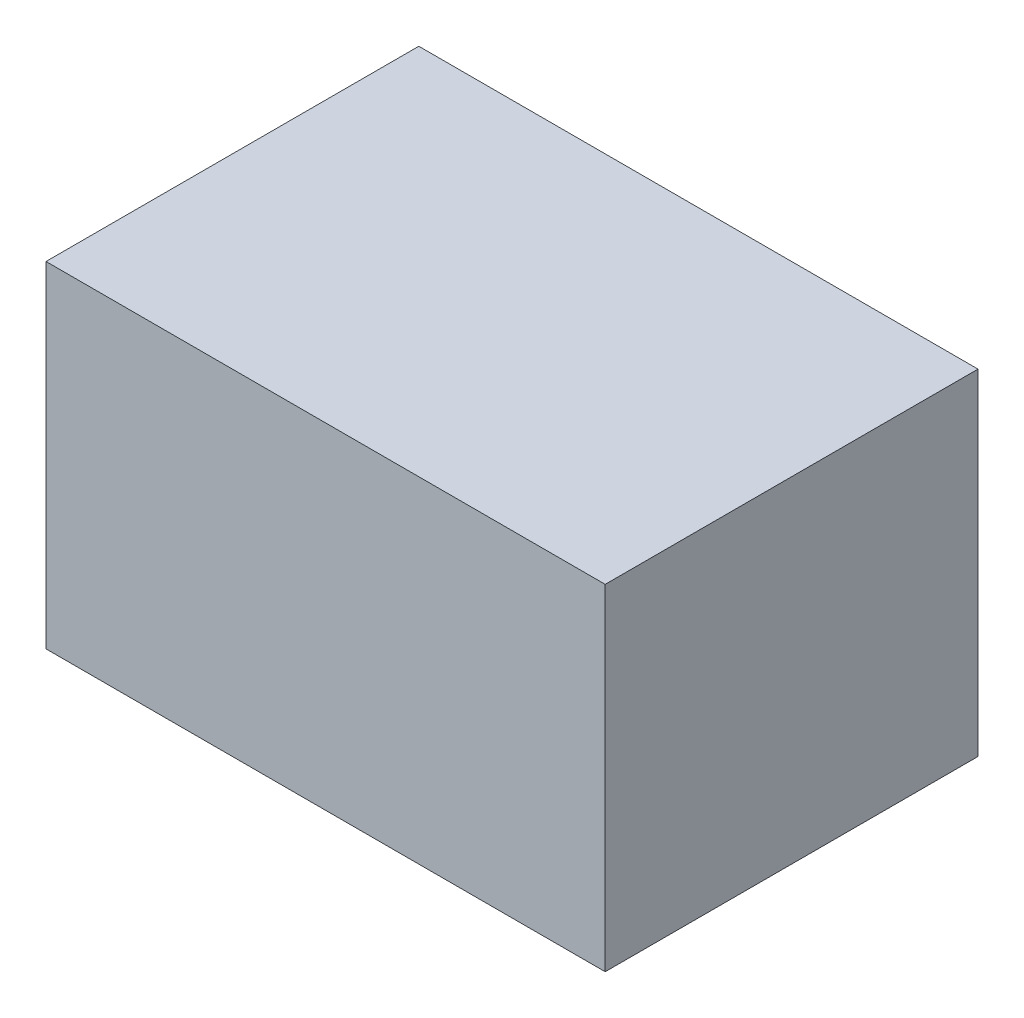
ISO-10303-21;
HEADER;
FILE_DESCRIPTION(('STEP AP214'),'2;1');
FILE_NAME('part.step','',(''),(''),'','','');
FILE_SCHEMA(('AUTOMOTIVE_DESIGN { 1 0 10303 214 1 1 1 1 }'));
ENDSEC;
DATA;
#1=APPLICATION_CONTEXT('core data for automotive mechanical design processes');
#2=APPLICATION_PROTOCOL_DEFINITION('international standard','automotive_design',2000,#1);
#3=PRODUCT_CONTEXT('',#1,'mechanical');
#4=PRODUCT('Part','Part','',(#3));
#5=PRODUCT_RELATED_PRODUCT_CATEGORY('part','',(#4));
#6=PRODUCT_DEFINITION_FORMATION('','',#4);
#7=PRODUCT_DEFINITION_CONTEXT('part definition',#1,'design');
#8=PRODUCT_DEFINITION('design','',#6,#7);
#9=PRODUCT_DEFINITION_SHAPE('','',#8);
#10=(LENGTH_UNIT() NAMED_UNIT(*) SI_UNIT(.MILLI.,.METRE.));
#11=(NAMED_UNIT(*) PLANE_ANGLE_UNIT() SI_UNIT($,.RADIAN.));
#12=(NAMED_UNIT(*) SI_UNIT($,.STERADIAN.) SOLID_ANGLE_UNIT());
#13=UNCERTAINTY_MEASURE_WITH_UNIT(LENGTH_MEASURE(1.E-05),#10,'distance_accuracy_value','');
#14=(GEOMETRIC_REPRESENTATION_CONTEXT(3) GLOBAL_UNCERTAINTY_ASSIGNED_CONTEXT((#13)) GLOBAL_UNIT_ASSIGNED_CONTEXT((#10,
#11,#12)) REPRESENTATION_CONTEXT('',''));
#15=CARTESIAN_POINT('',(0.,0.,0.));
#16=DIRECTION('',(0.,0.,1.));
#17=DIRECTION('',(1.,0.,0.));
#18=AXIS2_PLACEMENT_3D('',#15,#16,#17);
#19=CARTESIAN_POINT('',(0.,18.,0.));
#20=DIRECTION('',(1.,0.,0.));
#21=DIRECTION('',(0.,0.,-1.));
#22=AXIS2_PLACEMENT_3D('',#19,#20,#21);
#23=PLANE('',#22);
#24=DIRECTION('',(0.,0.,1.));
#25=VECTOR('',#24,1.);
#26=CARTESIAN_POINT('',(0.,0.,0.));
#27=LINE('',#26,#25);
#28=CARTESIAN_POINT('',(0.,0.,-20.));
#29=VERTEX_POINT('',#28);
#30=CARTESIAN_POINT('',(0.,0.,0.));
#31=VERTEX_POINT('',#30);
#32=EDGE_CURVE('E96',#29,#31,#27,.T.);
#33=ORIENTED_EDGE('',*,*,#32,.T.);
#34=DIRECTION('',(0.,-1.,0.));
#35=VECTOR('',#34,1.);
#36=CARTESIAN_POINT('',(0.,18.,0.));
#37=LINE('',#36,#35);
#38=CARTESIAN_POINT('',(0.,18.,0.));
#39=VERTEX_POINT('',#38);
#40=EDGE_CURVE('E11',#39,#31,#37,.T.);
#41=ORIENTED_EDGE('',*,*,#40,.F.);
#42=DIRECTION('',(0.,0.,1.));
#43=VECTOR('',#42,1.);
#44=CARTESIAN_POINT('',(0.,18.,0.));
#45=LINE('',#44,#43);
#46=CARTESIAN_POINT('',(0.,18.,-20.));
#47=VERTEX_POINT('',#46);
#48=EDGE_CURVE('E84',#47,#39,#45,.T.);
#49=ORIENTED_EDGE('',*,*,#48,.F.);
#50=DIRECTION('',(0.,-1.,0.));
#51=VECTOR('',#50,1.);
#52=CARTESIAN_POINT('',(0.,18.,-20.));
#53=LINE('',#52,#51);
#54=EDGE_CURVE('E92',#47,#29,#53,.T.);
#55=ORIENTED_EDGE('',*,*,#54,.T.);
#56=EDGE_LOOP('',(#33,#41,#49,#55));
#57=FACE_BOUND('',#56,.T.);
#58=ADVANCED_FACE('F33',(#57),#23,.F.);
#59=CARTESIAN_POINT('',(0.,18.,0.));
#60=DIRECTION('',(0.,0.,-1.));
#61=DIRECTION('',(-1.,0.,0.));
#62=AXIS2_PLACEMENT_3D('',#59,#60,#61);
#63=PLANE('',#62);
#64=DIRECTION('',(1.,0.,0.));
#65=VECTOR('',#64,1.);
#66=CARTESIAN_POINT('',(0.,0.,0.));
#67=LINE('',#66,#65);
#68=CARTESIAN_POINT('',(30.,0.,0.));
#69=VERTEX_POINT('',#68);
#70=EDGE_CURVE('E88',#31,#69,#67,.T.);
#71=ORIENTED_EDGE('',*,*,#70,.T.);
#72=DIRECTION('',(0.,-1.,0.));
#73=VECTOR('',#72,1.);
#74=CARTESIAN_POINT('',(30.,18.,0.));
#75=LINE('',#74,#73);
#76=CARTESIAN_POINT('',(30.,18.,0.));
#77=VERTEX_POINT('',#76);
#78=EDGE_CURVE('E41',#77,#69,#75,.T.);
#79=ORIENTED_EDGE('',*,*,#78,.F.);
#80=DIRECTION('',(1.,0.,0.));
#81=VECTOR('',#80,1.);
#82=CARTESIAN_POINT('',(0.,18.,0.));
#83=LINE('',#82,#81);
#84=EDGE_CURVE('E79',#39,#77,#83,.T.);
#85=ORIENTED_EDGE('',*,*,#84,.F.);
#86=ORIENTED_EDGE('',*,*,#40,.T.);
#87=EDGE_LOOP('',(#71,#79,#85,#86));
#88=FACE_BOUND('',#87,.T.);
#89=ADVANCED_FACE('F87',(#88),#63,.F.);
#90=CARTESIAN_POINT('',(30.,18.,0.));
#91=DIRECTION('',(-1.,0.,0.));
#92=DIRECTION('',(0.,0.,1.));
#93=AXIS2_PLACEMENT_3D('',#90,#91,#92);
#94=PLANE('',#93);
#95=DIRECTION('',(0.,0.,-1.));
#96=VECTOR('',#95,1.);
#97=CARTESIAN_POINT('',(30.,0.,0.));
#98=LINE('',#97,#96);
#99=CARTESIAN_POINT('',(30.,0.,-20.));
#100=VERTEX_POINT('',#99);
#101=EDGE_CURVE('E66',#69,#100,#98,.T.);
#102=ORIENTED_EDGE('',*,*,#101,.T.);
#103=DIRECTION('',(0.,-1.,0.));
#104=VECTOR('',#103,1.);
#105=CARTESIAN_POINT('',(30.,18.,-20.));
#106=LINE('',#105,#104);
#107=CARTESIAN_POINT('',(30.,18.,-20.));
#108=VERTEX_POINT('',#107);
#109=EDGE_CURVE('E89',#108,#100,#106,.T.);
#110=ORIENTED_EDGE('',*,*,#109,.F.);
#111=DIRECTION('',(0.,0.,-1.));
#112=VECTOR('',#111,1.);
#113=CARTESIAN_POINT('',(30.,18.,0.));
#114=LINE('',#113,#112);
#115=EDGE_CURVE('E82',#77,#108,#114,.T.);
#116=ORIENTED_EDGE('',*,*,#115,.F.);
#117=ORIENTED_EDGE('',*,*,#78,.T.);
#118=EDGE_LOOP('',(#102,#110,#116,#117));
#119=FACE_BOUND('',#118,.T.);
#120=ADVANCED_FACE('F90',(#119),#94,.F.);
#121=CARTESIAN_POINT('',(0.,18.,-20.));
#122=DIRECTION('',(0.,0.,1.));
#123=DIRECTION('',(1.,0.,0.));
#124=AXIS2_PLACEMENT_3D('',#121,#122,#123);
#125=PLANE('',#124);
#126=DIRECTION('',(-1.,0.,0.));
#127=VECTOR('',#126,1.);
#128=CARTESIAN_POINT('',(0.,0.,-20.));
#129=LINE('',#128,#127);
#130=EDGE_CURVE('E72',#100,#29,#129,.T.);
#131=ORIENTED_EDGE('',*,*,#130,.T.);
#132=ORIENTED_EDGE('',*,*,#54,.F.);
#133=DIRECTION('',(-1.,0.,0.));
#134=VECTOR('',#133,1.);
#135=CARTESIAN_POINT('',(0.,18.,-20.));
#136=LINE('',#135,#134);
#137=EDGE_CURVE('E49',#108,#47,#136,.T.);
#138=ORIENTED_EDGE('',*,*,#137,.F.);
#139=ORIENTED_EDGE('',*,*,#109,.T.);
#140=EDGE_LOOP('',(#131,#132,#138,#139));
#141=FACE_BOUND('',#140,.T.);
#142=ADVANCED_FACE('F103',(#141),#125,.F.);
#143=CARTESIAN_POINT('',(0.,18.,0.));
#144=DIRECTION('',(0.,-1.,0.));
#145=DIRECTION('',(0.,0.,-1.));
#146=AXIS2_PLACEMENT_3D('',#143,#144,#145);
#147=PLANE('',#146);
#148=ORIENTED_EDGE('',*,*,#48,.T.);
#149=ORIENTED_EDGE('',*,*,#84,.T.);
#150=ORIENTED_EDGE('',*,*,#115,.T.);
#151=ORIENTED_EDGE('',*,*,#137,.T.);
#152=EDGE_LOOP('',(#148,#149,#150,#151));
#153=FACE_BOUND('',#152,.T.);
#154=ADVANCED_FACE('F80',(#153),#147,.F.);
#155=CARTESIAN_POINT('',(0.,0.,0.));
#156=DIRECTION('',(0.,-1.,0.));
#157=DIRECTION('',(0.,0.,-1.));
#158=AXIS2_PLACEMENT_3D('',#155,#156,#157);
#159=PLANE('',#158);
#160=ORIENTED_EDGE('',*,*,#32,.F.);
#161=ORIENTED_EDGE('',*,*,#130,.F.);
#162=ORIENTED_EDGE('',*,*,#101,.F.);
#163=ORIENTED_EDGE('',*,*,#70,.F.);
#164=EDGE_LOOP('',(#160,#161,#162,#163));
#165=FACE_BOUND('',#164,.T.);
#166=ADVANCED_FACE('F106',(#165),#159,.T.);
#167=CLOSED_SHELL('',(#58,#89,#120,#142,#154,#166));
#168=MANIFOLD_SOLID_BREP('B2',#167);
#169=ADVANCED_BREP_SHAPE_REPRESENTATION('',(#18,#168),#14);
#170=SHAPE_DEFINITION_REPRESENTATION(#9,#169);
ENDSEC;
END-ISO-10303-21;
